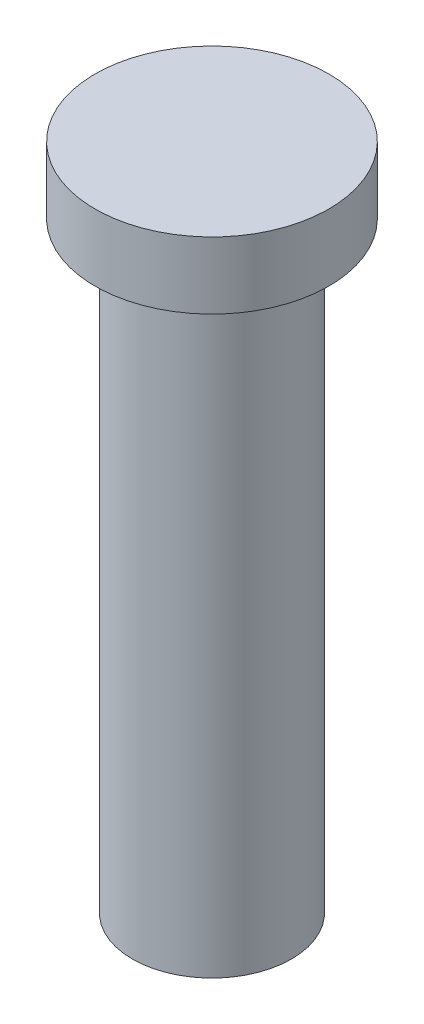
ISO-10303-21;
HEADER;
FILE_DESCRIPTION(('STEP AP214'),'2;1');
FILE_NAME('part.step','',(''),(''),'','','');
FILE_SCHEMA(('AUTOMOTIVE_DESIGN { 1 0 10303 214 1 1 1 1 }'));
ENDSEC;
DATA;
#1=APPLICATION_CONTEXT('core data for automotive mechanical design processes');
#2=APPLICATION_PROTOCOL_DEFINITION('international standard','automotive_design',2000,#1);
#3=PRODUCT_CONTEXT('',#1,'mechanical');
#4=PRODUCT('Part','Part','',(#3));
#5=PRODUCT_RELATED_PRODUCT_CATEGORY('part','',(#4));
#6=PRODUCT_DEFINITION_FORMATION('','',#4);
#7=PRODUCT_DEFINITION_CONTEXT('part definition',#1,'design');
#8=PRODUCT_DEFINITION('design','',#6,#7);
#9=PRODUCT_DEFINITION_SHAPE('','',#8);
#10=(LENGTH_UNIT() NAMED_UNIT(*) SI_UNIT(.MILLI.,.METRE.));
#11=(NAMED_UNIT(*) PLANE_ANGLE_UNIT() SI_UNIT($,.RADIAN.));
#12=(NAMED_UNIT(*) SI_UNIT($,.STERADIAN.) SOLID_ANGLE_UNIT());
#13=UNCERTAINTY_MEASURE_WITH_UNIT(LENGTH_MEASURE(1.E-05),#10,'distance_accuracy_value','');
#14=(GEOMETRIC_REPRESENTATION_CONTEXT(3) GLOBAL_UNCERTAINTY_ASSIGNED_CONTEXT((#13)) GLOBAL_UNIT_ASSIGNED_CONTEXT((#10,
#11,#12)) REPRESENTATION_CONTEXT('',''));
#15=CARTESIAN_POINT('',(0.,0.,0.));
#16=DIRECTION('',(0.,0.,1.));
#17=DIRECTION('',(1.,0.,0.));
#18=AXIS2_PLACEMENT_3D('',#15,#16,#17);
#19=CARTESIAN_POINT('',(0.,0.,0.));
#20=DIRECTION('',(0.,-1.,0.));
#21=DIRECTION('',(0.,0.,-1.));
#22=AXIS2_PLACEMENT_3D('',#19,#20,#21);
#23=PLANE('',#22);
#24=CARTESIAN_POINT('',(0.,0.,0.));
#25=DIRECTION('',(0.,-1.,0.));
#26=DIRECTION('',(0.,0.,-1.));
#27=AXIS2_PLACEMENT_3D('',#24,#25,#26);
#28=CIRCLE('',#27,4.7625);
#29=CARTESIAN_POINT('',(0.,0.,-4.7625));
#30=VERTEX_POINT('',#29);
#31=EDGE_CURVE('E10',#30,#30,#28,.T.);
#32=ORIENTED_EDGE('',*,*,#31,.T.);
#33=EDGE_LOOP('',(#32));
#34=FACE_BOUND('',#33,.T.);
#35=ADVANCED_FACE('F40',(#34),#23,.T.);
#36=CARTESIAN_POINT('',(0.,0.,0.));
#37=DIRECTION('',(0.,-1.,0.));
#38=DIRECTION('',(0.,0.,-1.));
#39=AXIS2_PLACEMENT_3D('',#36,#37,#38);
#40=CYLINDRICAL_SURFACE('',#39,4.7625);
#41=CARTESIAN_POINT('',(0.,36.,0.));
#42=DIRECTION('',(0.,-1.,0.));
#43=DIRECTION('',(0.,0.,-1.));
#44=AXIS2_PLACEMENT_3D('',#41,#42,#43);
#45=CIRCLE('',#44,4.7625);
#46=CARTESIAN_POINT('',(0.,36.,-4.7625));
#47=VERTEX_POINT('',#46);
#48=EDGE_CURVE('E43',#47,#47,#45,.T.);
#49=ORIENTED_EDGE('',*,*,#48,.T.);
#50=EDGE_LOOP('',(#49));
#51=FACE_BOUND('',#50,.T.);
#52=ORIENTED_EDGE('',*,*,#31,.F.);
#53=EDGE_LOOP('',(#52));
#54=FACE_BOUND('',#53,.T.);
#55=ADVANCED_FACE('F69',(#51,#54),#40,.T.);
#56=CARTESIAN_POINT('',(4.7625,36.,0.));
#57=DIRECTION('',(0.,-1.,0.));
#58=DIRECTION('',(0.,0.,-1.));
#59=AXIS2_PLACEMENT_3D('',#56,#57,#58);
#60=PLANE('',#59);
#61=CARTESIAN_POINT('',(0.,36.,0.));
#62=DIRECTION('',(0.,-1.,0.));
#63=DIRECTION('',(0.,0.,-1.));
#64=AXIS2_PLACEMENT_3D('',#61,#62,#63);
#65=CIRCLE('',#64,7.);
#66=CARTESIAN_POINT('',(0.,36.,-7.));
#67=VERTEX_POINT('',#66);
#68=EDGE_CURVE('E50',#67,#67,#65,.T.);
#69=ORIENTED_EDGE('',*,*,#68,.T.);
#70=EDGE_LOOP('',(#69));
#71=FACE_BOUND('',#70,.T.);
#72=ORIENTED_EDGE('',*,*,#48,.F.);
#73=EDGE_LOOP('',(#72));
#74=FACE_BOUND('',#73,.T.);
#75=ADVANCED_FACE('F67',(#71,#74),#60,.T.);
#76=CARTESIAN_POINT('',(0.,0.,0.));
#77=DIRECTION('',(0.,-1.,0.));
#78=DIRECTION('',(0.,0.,-1.));
#79=AXIS2_PLACEMENT_3D('',#76,#77,#78);
#80=CYLINDRICAL_SURFACE('',#79,7.);
#81=CARTESIAN_POINT('',(0.,40.,0.));
#82=DIRECTION('',(0.,-1.,0.));
#83=DIRECTION('',(0.,0.,-1.));
#84=AXIS2_PLACEMENT_3D('',#81,#82,#83);
#85=CIRCLE('',#84,7.);
#86=CARTESIAN_POINT('',(0.,40.,-7.));
#87=VERTEX_POINT('',#86);
#88=EDGE_CURVE('E51',#87,#87,#85,.T.);
#89=ORIENTED_EDGE('',*,*,#88,.T.);
#90=EDGE_LOOP('',(#89));
#91=FACE_BOUND('',#90,.T.);
#92=ORIENTED_EDGE('',*,*,#68,.F.);
#93=EDGE_LOOP('',(#92));
#94=FACE_BOUND('',#93,.T.);
#95=ADVANCED_FACE('F60',(#91,#94),#80,.T.);
#96=CARTESIAN_POINT('',(7.,40.,0.));
#97=DIRECTION('',(0.,1.,0.));
#98=DIRECTION('',(0.,0.,1.));
#99=AXIS2_PLACEMENT_3D('',#96,#97,#98);
#100=PLANE('',#99);
#101=ORIENTED_EDGE('',*,*,#88,.F.);
#102=EDGE_LOOP('',(#101));
#103=FACE_BOUND('',#102,.T.);
#104=ADVANCED_FACE('F58',(#103),#100,.T.);
#105=CLOSED_SHELL('',(#35,#55,#75,#95,#104));
#106=MANIFOLD_SOLID_BREP('B2',#105);
#107=ADVANCED_BREP_SHAPE_REPRESENTATION('',(#18,#106),#14);
#108=SHAPE_DEFINITION_REPRESENTATION(#9,#107);
ENDSEC;
END-ISO-10303-21;
